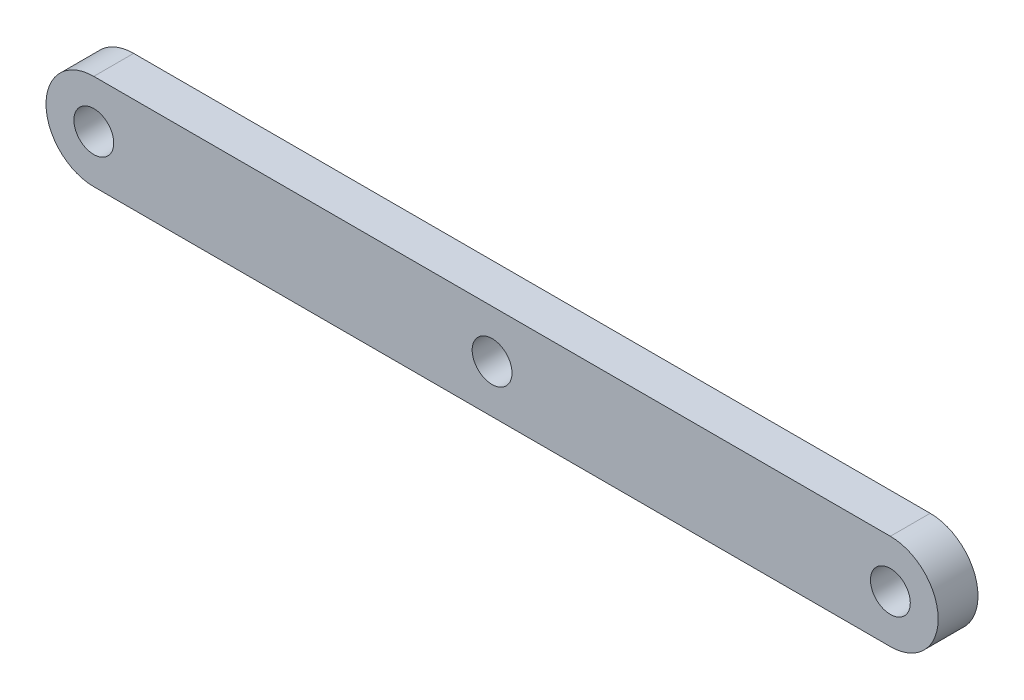
ISO-10303-21;
HEADER;
FILE_DESCRIPTION(('STEP AP214'),'2;1');
FILE_NAME('part.step','',(''),(''),'','','');
FILE_SCHEMA(('AUTOMOTIVE_DESIGN { 1 0 10303 214 1 1 1 1 }'));
ENDSEC;
DATA;
#1=APPLICATION_CONTEXT('core data for automotive mechanical design processes');
#2=APPLICATION_PROTOCOL_DEFINITION('international standard','automotive_design',2000,#1);
#3=PRODUCT_CONTEXT('',#1,'mechanical');
#4=PRODUCT('Part','Part','',(#3));
#5=PRODUCT_RELATED_PRODUCT_CATEGORY('part','',(#4));
#6=PRODUCT_DEFINITION_FORMATION('','',#4);
#7=PRODUCT_DEFINITION_CONTEXT('part definition',#1,'design');
#8=PRODUCT_DEFINITION('design','',#6,#7);
#9=PRODUCT_DEFINITION_SHAPE('','',#8);
#10=(LENGTH_UNIT() NAMED_UNIT(*) SI_UNIT(.MILLI.,.METRE.));
#11=(NAMED_UNIT(*) PLANE_ANGLE_UNIT() SI_UNIT($,.RADIAN.));
#12=(NAMED_UNIT(*) SI_UNIT($,.STERADIAN.) SOLID_ANGLE_UNIT());
#13=UNCERTAINTY_MEASURE_WITH_UNIT(LENGTH_MEASURE(1.E-05),#10,'distance_accuracy_value','');
#14=(GEOMETRIC_REPRESENTATION_CONTEXT(3) GLOBAL_UNCERTAINTY_ASSIGNED_CONTEXT((#13)) GLOBAL_UNIT_ASSIGNED_CONTEXT((#10,
#11,#12)) REPRESENTATION_CONTEXT('',''));
#15=CARTESIAN_POINT('',(0.,0.,0.));
#16=DIRECTION('',(0.,0.,1.));
#17=DIRECTION('',(1.,0.,0.));
#18=AXIS2_PLACEMENT_3D('',#15,#16,#17);
#19=CARTESIAN_POINT('',(-50.,0.,2.5));
#20=DIRECTION('',(0.,0.,1.));
#21=DIRECTION('',(1.,0.,0.));
#22=AXIS2_PLACEMENT_3D('',#19,#20,#21);
#23=PLANE('',#22);
#24=CARTESIAN_POINT('',(50.,0.,2.5));
#25=DIRECTION('',(0.,0.,1.));
#26=DIRECTION('',(1.,0.,0.));
#27=AXIS2_PLACEMENT_3D('',#24,#25,#26);
#28=CIRCLE('',#27,2.5);
#29=CARTESIAN_POINT('',(52.5,0.,2.5));
#30=VERTEX_POINT('',#29);
#31=EDGE_CURVE('E115',#30,#30,#28,.T.);
#32=ORIENTED_EDGE('',*,*,#31,.F.);
#33=EDGE_LOOP('',(#32));
#34=FACE_BOUND('',#33,.T.);
#35=CARTESIAN_POINT('',(-50.,0.,2.5));
#36=DIRECTION('',(0.,0.,1.));
#37=DIRECTION('',(1.,0.,0.));
#38=AXIS2_PLACEMENT_3D('',#35,#36,#37);
#39=CIRCLE('',#38,6.);
#40=CARTESIAN_POINT('',(-50.,6.00000000000001,2.5));
#41=VERTEX_POINT('',#40);
#42=CARTESIAN_POINT('',(-50.,-5.99999999999999,2.5));
#43=VERTEX_POINT('',#42);
#44=EDGE_CURVE('E85',#41,#43,#39,.T.);
#45=ORIENTED_EDGE('',*,*,#44,.T.);
#46=DIRECTION('',(1.,0.,0.));
#47=VECTOR('',#46,1.);
#48=CARTESIAN_POINT('',(-50.,-5.99999999999999,2.5));
#49=LINE('',#48,#47);
#50=CARTESIAN_POINT('',(50.,-6.,2.5));
#51=VERTEX_POINT('',#50);
#52=EDGE_CURVE('E80',#43,#51,#49,.T.);
#53=ORIENTED_EDGE('',*,*,#52,.T.);
#54=CARTESIAN_POINT('',(50.,0.,2.5));
#55=DIRECTION('',(0.,0.,1.));
#56=DIRECTION('',(1.,0.,0.));
#57=AXIS2_PLACEMENT_3D('',#54,#55,#56);
#58=CIRCLE('',#57,6.);
#59=CARTESIAN_POINT('',(50.,6.00000000000001,2.5));
#60=VERTEX_POINT('',#59);
#61=EDGE_CURVE('E83',#51,#60,#58,.T.);
#62=ORIENTED_EDGE('',*,*,#61,.T.);
#63=DIRECTION('',(-1.,0.,0.));
#64=VECTOR('',#63,1.);
#65=CARTESIAN_POINT('',(-50.,6.00000000000001,2.5));
#66=LINE('',#65,#64);
#67=EDGE_CURVE('E50',#60,#41,#66,.T.);
#68=ORIENTED_EDGE('',*,*,#67,.T.);
#69=EDGE_LOOP('',(#45,#53,#62,#68));
#70=FACE_BOUND('',#69,.T.);
#71=CARTESIAN_POINT('',(-50.,0.,2.5));
#72=DIRECTION('',(0.,0.,1.));
#73=DIRECTION('',(1.,0.,0.));
#74=AXIS2_PLACEMENT_3D('',#71,#72,#73);
#75=CIRCLE('',#74,2.5);
#76=CARTESIAN_POINT('',(-47.5,0.,2.5));
#77=VERTEX_POINT('',#76);
#78=EDGE_CURVE('E100',#77,#77,#75,.T.);
#79=ORIENTED_EDGE('',*,*,#78,.F.);
#80=EDGE_LOOP('',(#79));
#81=FACE_BOUND('',#80,.T.);
#82=CARTESIAN_POINT('',(0.,0.,2.5));
#83=DIRECTION('',(0.,0.,1.));
#84=DIRECTION('',(1.,0.,0.));
#85=AXIS2_PLACEMENT_3D('',#82,#83,#84);
#86=CIRCLE('',#85,2.5);
#87=CARTESIAN_POINT('',(2.5,0.,2.5));
#88=VERTEX_POINT('',#87);
#89=EDGE_CURVE('E121',#88,#88,#86,.T.);
#90=ORIENTED_EDGE('',*,*,#89,.F.);
#91=EDGE_LOOP('',(#90));
#92=FACE_BOUND('',#91,.T.);
#93=ADVANCED_FACE('F33',(#34,#70,#81,#92),#23,.T.);
#94=CARTESIAN_POINT('',(-50.,0.,-2.5));
#95=DIRECTION('',(0.,0.,1.));
#96=DIRECTION('',(1.,0.,0.));
#97=AXIS2_PLACEMENT_3D('',#94,#95,#96);
#98=PLANE('',#97);
#99=CARTESIAN_POINT('',(50.,0.,-2.5));
#100=DIRECTION('',(0.,0.,1.));
#101=DIRECTION('',(1.,0.,0.));
#102=AXIS2_PLACEMENT_3D('',#99,#100,#101);
#103=CIRCLE('',#102,2.5);
#104=CARTESIAN_POINT('',(52.5,0.,-2.5));
#105=VERTEX_POINT('',#104);
#106=EDGE_CURVE('E118',#105,#105,#103,.T.);
#107=ORIENTED_EDGE('',*,*,#106,.T.);
#108=EDGE_LOOP('',(#107));
#109=FACE_BOUND('',#108,.T.);
#110=CARTESIAN_POINT('',(-50.,0.,-2.5));
#111=DIRECTION('',(0.,0.,1.));
#112=DIRECTION('',(1.,0.,0.));
#113=AXIS2_PLACEMENT_3D('',#110,#111,#112);
#114=CIRCLE('',#113,6.);
#115=CARTESIAN_POINT('',(-50.,6.00000000000001,-2.5));
#116=VERTEX_POINT('',#115);
#117=CARTESIAN_POINT('',(-50.,-5.99999999999999,-2.5));
#118=VERTEX_POINT('',#117);
#119=EDGE_CURVE('E97',#116,#118,#114,.T.);
#120=ORIENTED_EDGE('',*,*,#119,.F.);
#121=DIRECTION('',(-1.,0.,0.));
#122=VECTOR('',#121,1.);
#123=CARTESIAN_POINT('',(-50.,6.00000000000001,-2.5));
#124=LINE('',#123,#122);
#125=CARTESIAN_POINT('',(50.,6.00000000000001,-2.5));
#126=VERTEX_POINT('',#125);
#127=EDGE_CURVE('E73',#126,#116,#124,.T.);
#128=ORIENTED_EDGE('',*,*,#127,.F.);
#129=CARTESIAN_POINT('',(50.,0.,-2.5));
#130=DIRECTION('',(0.,0.,1.));
#131=DIRECTION('',(1.,0.,0.));
#132=AXIS2_PLACEMENT_3D('',#129,#130,#131);
#133=CIRCLE('',#132,6.);
#134=CARTESIAN_POINT('',(50.,-6.,-2.5));
#135=VERTEX_POINT('',#134);
#136=EDGE_CURVE('E67',#135,#126,#133,.T.);
#137=ORIENTED_EDGE('',*,*,#136,.F.);
#138=DIRECTION('',(1.,0.,0.));
#139=VECTOR('',#138,1.);
#140=CARTESIAN_POINT('',(-50.,-5.99999999999999,-2.5));
#141=LINE('',#140,#139);
#142=EDGE_CURVE('E89',#118,#135,#141,.T.);
#143=ORIENTED_EDGE('',*,*,#142,.F.);
#144=EDGE_LOOP('',(#120,#128,#137,#143));
#145=FACE_BOUND('',#144,.T.);
#146=CARTESIAN_POINT('',(-50.,0.,-2.5));
#147=DIRECTION('',(0.,0.,1.));
#148=DIRECTION('',(1.,0.,0.));
#149=AXIS2_PLACEMENT_3D('',#146,#147,#148);
#150=CIRCLE('',#149,2.5);
#151=CARTESIAN_POINT('',(-47.5,0.,-2.5));
#152=VERTEX_POINT('',#151);
#153=EDGE_CURVE('E112',#152,#152,#150,.T.);
#154=ORIENTED_EDGE('',*,*,#153,.T.);
#155=EDGE_LOOP('',(#154));
#156=FACE_BOUND('',#155,.T.);
#157=CARTESIAN_POINT('',(0.,0.,-2.5));
#158=DIRECTION('',(0.,0.,1.));
#159=DIRECTION('',(1.,0.,0.));
#160=AXIS2_PLACEMENT_3D('',#157,#158,#159);
#161=CIRCLE('',#160,2.5);
#162=CARTESIAN_POINT('',(2.5,0.,-2.5));
#163=VERTEX_POINT('',#162);
#164=EDGE_CURVE('E124',#163,#163,#161,.T.);
#165=ORIENTED_EDGE('',*,*,#164,.T.);
#166=EDGE_LOOP('',(#165));
#167=FACE_BOUND('',#166,.T.);
#168=ADVANCED_FACE('F108',(#109,#145,#156,#167),#98,.F.);
#169=CARTESIAN_POINT('',(-50.,0.,2.5));
#170=DIRECTION('',(0.,0.,-1.));
#171=DIRECTION('',(-1.,0.,0.));
#172=AXIS2_PLACEMENT_3D('',#169,#170,#171);
#173=CYLINDRICAL_SURFACE('',#172,6.);
#174=ORIENTED_EDGE('',*,*,#119,.T.);
#175=DIRECTION('',(0.,0.,-1.));
#176=VECTOR('',#175,1.);
#177=CARTESIAN_POINT('',(-50.,-5.99999999999999,2.5));
#178=LINE('',#177,#176);
#179=EDGE_CURVE('E11',#43,#118,#178,.T.);
#180=ORIENTED_EDGE('',*,*,#179,.F.);
#181=ORIENTED_EDGE('',*,*,#44,.F.);
#182=DIRECTION('',(0.,0.,-1.));
#183=VECTOR('',#182,1.);
#184=CARTESIAN_POINT('',(-50.,6.00000000000001,2.5));
#185=LINE('',#184,#183);
#186=EDGE_CURVE('E93',#41,#116,#185,.T.);
#187=ORIENTED_EDGE('',*,*,#186,.T.);
#188=EDGE_LOOP('',(#174,#180,#181,#187));
#189=FACE_BOUND('',#188,.T.);
#190=ADVANCED_FACE('F35',(#189),#173,.T.);
#191=CARTESIAN_POINT('',(-50.,-5.99999999999999,2.5));
#192=DIRECTION('',(0.,1.,0.));
#193=DIRECTION('',(0.,0.,1.));
#194=AXIS2_PLACEMENT_3D('',#191,#192,#193);
#195=PLANE('',#194);
#196=ORIENTED_EDGE('',*,*,#142,.T.);
#197=DIRECTION('',(0.,0.,-1.));
#198=VECTOR('',#197,1.);
#199=CARTESIAN_POINT('',(50.,-6.,2.5));
#200=LINE('',#199,#198);
#201=EDGE_CURVE('E42',#51,#135,#200,.T.);
#202=ORIENTED_EDGE('',*,*,#201,.F.);
#203=ORIENTED_EDGE('',*,*,#52,.F.);
#204=ORIENTED_EDGE('',*,*,#179,.T.);
#205=EDGE_LOOP('',(#196,#202,#203,#204));
#206=FACE_BOUND('',#205,.T.);
#207=ADVANCED_FACE('F88',(#206),#195,.F.);
#208=CARTESIAN_POINT('',(50.,0.,2.5));
#209=DIRECTION('',(0.,0.,-1.));
#210=DIRECTION('',(-1.,0.,0.));
#211=AXIS2_PLACEMENT_3D('',#208,#209,#210);
#212=CYLINDRICAL_SURFACE('',#211,6.);
#213=ORIENTED_EDGE('',*,*,#136,.T.);
#214=DIRECTION('',(0.,0.,-1.));
#215=VECTOR('',#214,1.);
#216=CARTESIAN_POINT('',(50.,6.00000000000001,2.5));
#217=LINE('',#216,#215);
#218=EDGE_CURVE('E90',#60,#126,#217,.T.);
#219=ORIENTED_EDGE('',*,*,#218,.F.);
#220=ORIENTED_EDGE('',*,*,#61,.F.);
#221=ORIENTED_EDGE('',*,*,#201,.T.);
#222=EDGE_LOOP('',(#213,#219,#220,#221));
#223=FACE_BOUND('',#222,.T.);
#224=ADVANCED_FACE('F91',(#223),#212,.T.);
#225=CARTESIAN_POINT('',(-50.,6.00000000000001,2.5));
#226=DIRECTION('',(0.,-1.,0.));
#227=DIRECTION('',(1.,0.,0.));
#228=AXIS2_PLACEMENT_3D('',#225,#226,#227);
#229=PLANE('',#228);
#230=ORIENTED_EDGE('',*,*,#127,.T.);
#231=ORIENTED_EDGE('',*,*,#186,.F.);
#232=ORIENTED_EDGE('',*,*,#67,.F.);
#233=ORIENTED_EDGE('',*,*,#218,.T.);
#234=EDGE_LOOP('',(#230,#231,#232,#233));
#235=FACE_BOUND('',#234,.T.);
#236=ADVANCED_FACE('F105',(#235),#229,.F.);
#237=CARTESIAN_POINT('',(-50.,0.,2.5));
#238=DIRECTION('',(0.,0.,-1.));
#239=DIRECTION('',(-1.,0.,0.));
#240=AXIS2_PLACEMENT_3D('',#237,#238,#239);
#241=CYLINDRICAL_SURFACE('',#240,2.5);
#242=ORIENTED_EDGE('',*,*,#78,.T.);
#243=EDGE_LOOP('',(#242));
#244=FACE_BOUND('',#243,.T.);
#245=ORIENTED_EDGE('',*,*,#153,.F.);
#246=EDGE_LOOP('',(#245));
#247=FACE_BOUND('',#246,.T.);
#248=ADVANCED_FACE('F143',(#244,#247),#241,.F.);
#249=CARTESIAN_POINT('',(50.,0.,2.5));
#250=DIRECTION('',(0.,0.,-1.));
#251=DIRECTION('',(-1.,0.,0.));
#252=AXIS2_PLACEMENT_3D('',#249,#250,#251);
#253=CYLINDRICAL_SURFACE('',#252,2.5);
#254=ORIENTED_EDGE('',*,*,#31,.T.);
#255=EDGE_LOOP('',(#254));
#256=FACE_BOUND('',#255,.T.);
#257=ORIENTED_EDGE('',*,*,#106,.F.);
#258=EDGE_LOOP('',(#257));
#259=FACE_BOUND('',#258,.T.);
#260=ADVANCED_FACE('F189',(#256,#259),#253,.F.);
#261=CARTESIAN_POINT('',(0.,0.,2.5));
#262=DIRECTION('',(0.,0.,-1.));
#263=DIRECTION('',(-1.,0.,0.));
#264=AXIS2_PLACEMENT_3D('',#261,#262,#263);
#265=CYLINDRICAL_SURFACE('',#264,2.5);
#266=ORIENTED_EDGE('',*,*,#89,.T.);
#267=EDGE_LOOP('',(#266));
#268=FACE_BOUND('',#267,.T.);
#269=ORIENTED_EDGE('',*,*,#164,.F.);
#270=EDGE_LOOP('',(#269));
#271=FACE_BOUND('',#270,.T.);
#272=ADVANCED_FACE('F130',(#268,#271),#265,.F.);
#273=CLOSED_SHELL('',(#93,#168,#190,#207,#224,#236,#248,#260,#272));
#274=MANIFOLD_SOLID_BREP('B2',#273);
#275=ADVANCED_BREP_SHAPE_REPRESENTATION('',(#18,#274),#14);
#276=SHAPE_DEFINITION_REPRESENTATION(#9,#275);
ENDSEC;
END-ISO-10303-21;
